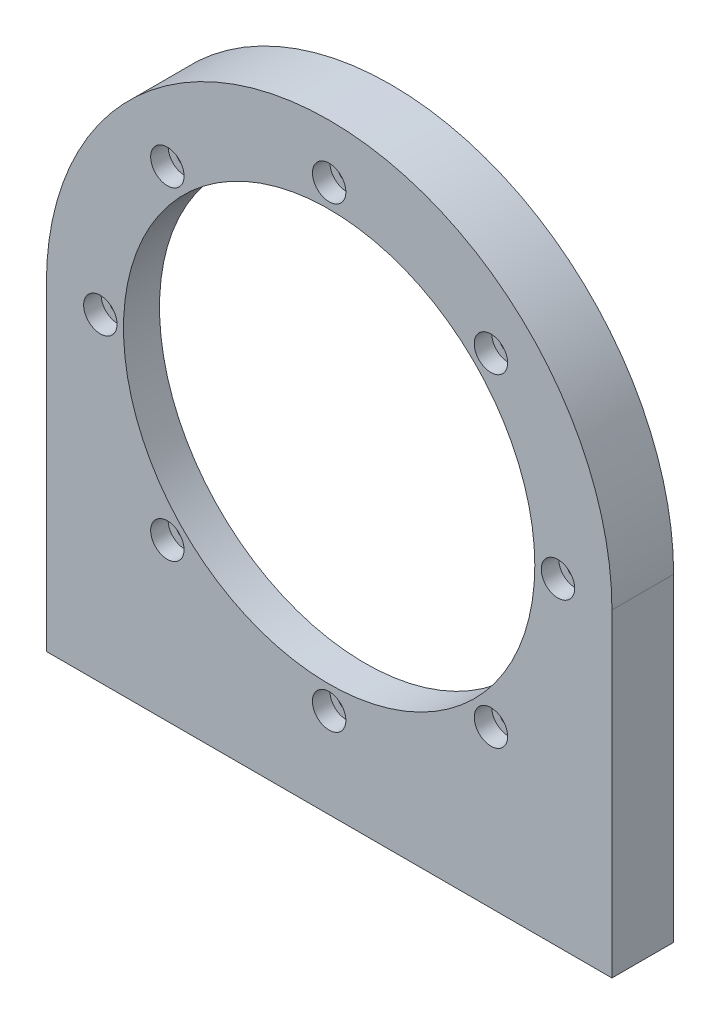
ISO-10303-21;
HEADER;
FILE_DESCRIPTION(('STEP AP214'),'2;1');
FILE_NAME('part.step','',(''),(''),'','','');
FILE_SCHEMA(('AUTOMOTIVE_DESIGN { 1 0 10303 214 1 1 1 1 }'));
ENDSEC;
DATA;
#1=APPLICATION_CONTEXT('core data for automotive mechanical design processes');
#2=APPLICATION_PROTOCOL_DEFINITION('international standard','automotive_design',2000,#1);
#3=PRODUCT_CONTEXT('',#1,'mechanical');
#4=PRODUCT('Part','Part','',(#3));
#5=PRODUCT_RELATED_PRODUCT_CATEGORY('part','',(#4));
#6=PRODUCT_DEFINITION_FORMATION('','',#4);
#7=PRODUCT_DEFINITION_CONTEXT('part definition',#1,'design');
#8=PRODUCT_DEFINITION('design','',#6,#7);
#9=PRODUCT_DEFINITION_SHAPE('','',#8);
#10=(LENGTH_UNIT() NAMED_UNIT(*) SI_UNIT(.MILLI.,.METRE.));
#11=(NAMED_UNIT(*) PLANE_ANGLE_UNIT() SI_UNIT($,.RADIAN.));
#12=(NAMED_UNIT(*) SI_UNIT($,.STERADIAN.) SOLID_ANGLE_UNIT());
#13=UNCERTAINTY_MEASURE_WITH_UNIT(LENGTH_MEASURE(1.E-05),#10,'distance_accuracy_value','');
#14=(GEOMETRIC_REPRESENTATION_CONTEXT(3) GLOBAL_UNCERTAINTY_ASSIGNED_CONTEXT((#13)) GLOBAL_UNIT_ASSIGNED_CONTEXT((#10,
#11,#12)) REPRESENTATION_CONTEXT('',''));
#15=CARTESIAN_POINT('',(0.,0.,0.));
#16=DIRECTION('',(0.,0.,1.));
#17=DIRECTION('',(1.,0.,0.));
#18=AXIS2_PLACEMENT_3D('',#15,#16,#17);
#19=CARTESIAN_POINT('',(0.,0.,7.));
#20=DIRECTION('',(0.,0.,-1.));
#21=DIRECTION('',(-1.,0.,0.));
#22=AXIS2_PLACEMENT_3D('',#19,#20,#21);
#23=CYLINDRICAL_SURFACE('',#22,55.);
#24=DIRECTION('',(0.,0.,1.));
#25=VECTOR('',#24,1.);
#26=CARTESIAN_POINT('',(-55.,0.,-131.269552941317));
#27=LINE('',#26,#25);
#28=CARTESIAN_POINT('',(-55.,0.,-5.));
#29=VERTEX_POINT('',#28);
#30=CARTESIAN_POINT('',(-55.,0.,7.));
#31=VERTEX_POINT('',#30);
#32=EDGE_CURVE('E60',#29,#31,#27,.T.);
#33=ORIENTED_EDGE('',*,*,#32,.T.);
#34=CARTESIAN_POINT('',(0.,0.,7.));
#35=DIRECTION('',(0.,0.,1.));
#36=DIRECTION('',(1.,0.,0.));
#37=AXIS2_PLACEMENT_3D('',#34,#35,#36);
#38=CIRCLE('',#37,55.);
#39=CARTESIAN_POINT('',(55.,0.,7.));
#40=VERTEX_POINT('',#39);
#41=EDGE_CURVE('E11',#40,#31,#38,.T.);
#42=ORIENTED_EDGE('',*,*,#41,.F.);
#43=DIRECTION('',(0.,0.,1.));
#44=VECTOR('',#43,1.);
#45=CARTESIAN_POINT('',(55.,0.,-131.269552941317));
#46=LINE('',#45,#44);
#47=CARTESIAN_POINT('',(55.,0.,-5.));
#48=VERTEX_POINT('',#47);
#49=EDGE_CURVE('E112',#48,#40,#46,.T.);
#50=ORIENTED_EDGE('',*,*,#49,.F.);
#51=CARTESIAN_POINT('',(0.,0.,-5.));
#52=DIRECTION('',(0.,0.,-1.));
#53=DIRECTION('',(-1.,0.,0.));
#54=AXIS2_PLACEMENT_3D('',#51,#52,#53);
#55=CIRCLE('',#54,55.);
#56=EDGE_CURVE('E140',#29,#48,#55,.T.);
#57=ORIENTED_EDGE('',*,*,#56,.F.);
#58=EDGE_LOOP('',(#33,#42,#50,#57));
#59=FACE_BOUND('',#58,.T.);
#60=ADVANCED_FACE('F45',(#59),#23,.T.);
#61=CARTESIAN_POINT('',(0.,0.,0.));
#62=DIRECTION('',(0.,0.,1.));
#63=DIRECTION('',(1.,0.,0.));
#64=AXIS2_PLACEMENT_3D('',#61,#62,#63);
#65=PLANE('',#64);
#66=CARTESIAN_POINT('',(0.,0.,0.));
#67=DIRECTION('',(0.,0.,1.));
#68=DIRECTION('',(1.,0.,0.));
#69=AXIS2_PLACEMENT_3D('',#66,#67,#68);
#70=CIRCLE('',#69,40.);
#71=CARTESIAN_POINT('',(40.,0.,0.));
#72=VERTEX_POINT('',#71);
#73=EDGE_CURVE('E274',#72,#72,#70,.T.);
#74=ORIENTED_EDGE('',*,*,#73,.T.);
#75=EDGE_LOOP('',(#74));
#76=FACE_BOUND('',#75,.T.);
#77=CARTESIAN_POINT('',(-31.4662517628008,31.4662517628,0.));
#78=DIRECTION('',(0.,0.,1.));
#79=DIRECTION('',(1.,0.,0.));
#80=AXIS2_PLACEMENT_3D('',#77,#78,#79);
#81=CIRCLE('',#80,1.7);
#82=CARTESIAN_POINT('',(-29.7662517628008,31.4662517628,0.));
#83=VERTEX_POINT('',#82);
#84=EDGE_CURVE('E270',#83,#83,#81,.T.);
#85=ORIENTED_EDGE('',*,*,#84,.T.);
#86=EDGE_LOOP('',(#85));
#87=FACE_BOUND('',#86,.T.);
#88=CARTESIAN_POINT('',(-44.4999999999981,-1.89442426535137E-12,0.));
#89=DIRECTION('',(0.,0.,1.));
#90=DIRECTION('',(1.,0.,0.));
#91=AXIS2_PLACEMENT_3D('',#88,#89,#90);
#92=CIRCLE('',#91,1.7);
#93=CARTESIAN_POINT('',(-42.7999999999981,-1.89442426535137E-12,0.));
#94=VERTEX_POINT('',#93);
#95=EDGE_CURVE('E254',#94,#94,#92,.T.);
#96=ORIENTED_EDGE('',*,*,#95,.T.);
#97=EDGE_LOOP('',(#96));
#98=FACE_BOUND('',#97,.T.);
#99=CARTESIAN_POINT('',(-31.4662517627981,-31.4662517628027,0.));
#100=DIRECTION('',(0.,0.,1.));
#101=DIRECTION('',(1.,0.,0.));
#102=AXIS2_PLACEMENT_3D('',#99,#100,#101);
#103=CIRCLE('',#102,1.7);
#104=CARTESIAN_POINT('',(-29.7662517627981,-31.4662517628027,0.));
#105=VERTEX_POINT('',#104);
#106=EDGE_CURVE('E238',#105,#105,#103,.T.);
#107=ORIENTED_EDGE('',*,*,#106,.T.);
#108=EDGE_LOOP('',(#107));
#109=FACE_BOUND('',#108,.T.);
#110=CARTESIAN_POINT('',(3.77794917419032E-12,-44.5,0.));
#111=DIRECTION('',(0.,0.,1.));
#112=DIRECTION('',(1.,0.,0.));
#113=AXIS2_PLACEMENT_3D('',#110,#111,#112);
#114=CIRCLE('',#113,1.7);
#115=CARTESIAN_POINT('',(1.70000000000378,-44.5,0.));
#116=VERTEX_POINT('',#115);
#117=EDGE_CURVE('E222',#116,#116,#114,.T.);
#118=ORIENTED_EDGE('',*,*,#117,.T.);
#119=EDGE_LOOP('',(#118));
#120=FACE_BOUND('',#119,.T.);
#121=CARTESIAN_POINT('',(31.4662517628046,-31.4662517628,0.));
#122=DIRECTION('',(0.,0.,1.));
#123=DIRECTION('',(1.,0.,0.));
#124=AXIS2_PLACEMENT_3D('',#121,#122,#123);
#125=CIRCLE('',#124,1.7);
#126=CARTESIAN_POINT('',(33.1662517628046,-31.4662517628,0.));
#127=VERTEX_POINT('',#126);
#128=EDGE_CURVE('E206',#127,#127,#125,.T.);
#129=ORIENTED_EDGE('',*,*,#128,.T.);
#130=EDGE_LOOP('',(#129));
#131=FACE_BOUND('',#130,.T.);
#132=CARTESIAN_POINT('',(44.5000000000019,1.88897458709516E-12,0.));
#133=DIRECTION('',(0.,0.,1.));
#134=DIRECTION('',(1.,0.,0.));
#135=AXIS2_PLACEMENT_3D('',#132,#133,#134);
#136=CIRCLE('',#135,1.7);
#137=CARTESIAN_POINT('',(46.2000000000019,1.88897458709516E-12,0.));
#138=VERTEX_POINT('',#137);
#139=EDGE_CURVE('E190',#138,#138,#136,.T.);
#140=ORIENTED_EDGE('',*,*,#139,.T.);
#141=EDGE_LOOP('',(#140));
#142=FACE_BOUND('',#141,.T.);
#143=CARTESIAN_POINT('',(31.4662517628019,31.4662517628027,0.));
#144=DIRECTION('',(0.,0.,1.));
#145=DIRECTION('',(1.,0.,0.));
#146=AXIS2_PLACEMENT_3D('',#143,#144,#145);
#147=CIRCLE('',#146,1.7);
#148=CARTESIAN_POINT('',(33.1662517628019,31.4662517628027,0.));
#149=VERTEX_POINT('',#148);
#150=EDGE_CURVE('E174',#149,#149,#147,.T.);
#151=ORIENTED_EDGE('',*,*,#150,.T.);
#152=EDGE_LOOP('',(#151));
#153=FACE_BOUND('',#152,.T.);
#154=CARTESIAN_POINT('',(0.,44.5,0.));
#155=DIRECTION('',(0.,0.,1.));
#156=DIRECTION('',(1.,0.,0.));
#157=AXIS2_PLACEMENT_3D('',#154,#155,#156);
#158=CIRCLE('',#157,1.7);
#159=CARTESIAN_POINT('',(1.7,44.5,0.));
#160=VERTEX_POINT('',#159);
#161=EDGE_CURVE('E158',#160,#160,#158,.T.);
#162=ORIENTED_EDGE('',*,*,#161,.T.);
#163=EDGE_LOOP('',(#162));
#164=FACE_BOUND('',#163,.T.);
#165=CARTESIAN_POINT('',(0.,0.,0.));
#166=DIRECTION('',(0.,0.,-1.));
#167=DIRECTION('',(-1.,0.,0.));
#168=AXIS2_PLACEMENT_3D('',#165,#166,#167);
#169=CIRCLE('',#168,50.);
#170=CARTESIAN_POINT('',(-50.,0.,0.));
#171=VERTEX_POINT('',#170);
#172=EDGE_CURVE('E135',#171,#171,#169,.T.);
#173=ORIENTED_EDGE('',*,*,#172,.T.);
#174=EDGE_LOOP('',(#173));
#175=FACE_BOUND('',#174,.T.);
#176=ADVANCED_FACE('F281',(#76,#87,#98,#109,#120,#131,#142,#153,#164,#175),#65,.F.);
#177=CARTESIAN_POINT('',(0.,0.,7.));
#178=DIRECTION('',(0.,0.,1.));
#179=DIRECTION('',(1.,0.,0.));
#180=AXIS2_PLACEMENT_3D('',#177,#178,#179);
#181=PLANE('',#180);
#182=CARTESIAN_POINT('',(0.,44.5,7.));
#183=DIRECTION('',(0.,0.,1.));
#184=DIRECTION('',(1.,0.,0.));
#185=AXIS2_PLACEMENT_3D('',#182,#183,#184);
#186=CIRCLE('',#185,3.25);
#187=CARTESIAN_POINT('',(3.25,44.5,7.));
#188=VERTEX_POINT('',#187);
#189=EDGE_CURVE('E146',#188,#188,#186,.T.);
#190=ORIENTED_EDGE('',*,*,#189,.F.);
#191=EDGE_LOOP('',(#190));
#192=FACE_BOUND('',#191,.T.);
#193=CARTESIAN_POINT('',(31.4662517628019,31.4662517628027,7.));
#194=DIRECTION('',(0.,0.,1.));
#195=DIRECTION('',(1.,0.,0.));
#196=AXIS2_PLACEMENT_3D('',#193,#194,#195);
#197=CIRCLE('',#196,3.25);
#198=CARTESIAN_POINT('',(34.7162517628019,31.4662517628027,7.));
#199=VERTEX_POINT('',#198);
#200=EDGE_CURVE('E162',#199,#199,#197,.T.);
#201=ORIENTED_EDGE('',*,*,#200,.F.);
#202=EDGE_LOOP('',(#201));
#203=FACE_BOUND('',#202,.T.);
#204=CARTESIAN_POINT('',(44.5000000000019,1.88897458709516E-12,7.));
#205=DIRECTION('',(0.,0.,1.));
#206=DIRECTION('',(1.,0.,0.));
#207=AXIS2_PLACEMENT_3D('',#204,#205,#206);
#208=CIRCLE('',#207,3.25);
#209=CARTESIAN_POINT('',(47.7500000000019,1.88897458709516E-12,7.));
#210=VERTEX_POINT('',#209);
#211=EDGE_CURVE('E178',#210,#210,#208,.T.);
#212=ORIENTED_EDGE('',*,*,#211,.F.);
#213=EDGE_LOOP('',(#212));
#214=FACE_BOUND('',#213,.T.);
#215=CARTESIAN_POINT('',(31.4662517628046,-31.4662517628,7.));
#216=DIRECTION('',(0.,0.,1.));
#217=DIRECTION('',(1.,0.,0.));
#218=AXIS2_PLACEMENT_3D('',#215,#216,#217);
#219=CIRCLE('',#218,3.25);
#220=CARTESIAN_POINT('',(34.7162517628046,-31.4662517628,7.));
#221=VERTEX_POINT('',#220);
#222=EDGE_CURVE('E194',#221,#221,#219,.T.);
#223=ORIENTED_EDGE('',*,*,#222,.F.);
#224=EDGE_LOOP('',(#223));
#225=FACE_BOUND('',#224,.T.);
#226=CARTESIAN_POINT('',(3.77794917419032E-12,-44.5,7.));
#227=DIRECTION('',(0.,0.,1.));
#228=DIRECTION('',(1.,0.,0.));
#229=AXIS2_PLACEMENT_3D('',#226,#227,#228);
#230=CIRCLE('',#229,3.25);
#231=CARTESIAN_POINT('',(3.25000000000378,-44.5,7.));
#232=VERTEX_POINT('',#231);
#233=EDGE_CURVE('E210',#232,#232,#230,.T.);
#234=ORIENTED_EDGE('',*,*,#233,.F.);
#235=EDGE_LOOP('',(#234));
#236=FACE_BOUND('',#235,.T.);
#237=CARTESIAN_POINT('',(-31.4662517627981,-31.4662517628027,7.));
#238=DIRECTION('',(0.,0.,1.));
#239=DIRECTION('',(1.,0.,0.));
#240=AXIS2_PLACEMENT_3D('',#237,#238,#239);
#241=CIRCLE('',#240,3.25);
#242=CARTESIAN_POINT('',(-28.2162517627981,-31.4662517628027,7.));
#243=VERTEX_POINT('',#242);
#244=EDGE_CURVE('E226',#243,#243,#241,.T.);
#245=ORIENTED_EDGE('',*,*,#244,.F.);
#246=EDGE_LOOP('',(#245));
#247=FACE_BOUND('',#246,.T.);
#248=CARTESIAN_POINT('',(-44.4999999999981,-1.89442426535137E-12,7.));
#249=DIRECTION('',(0.,0.,1.));
#250=DIRECTION('',(1.,0.,0.));
#251=AXIS2_PLACEMENT_3D('',#248,#249,#250);
#252=CIRCLE('',#251,3.25);
#253=CARTESIAN_POINT('',(-41.2499999999981,-1.89442426535137E-12,7.));
#254=VERTEX_POINT('',#253);
#255=EDGE_CURVE('E242',#254,#254,#252,.T.);
#256=ORIENTED_EDGE('',*,*,#255,.F.);
#257=EDGE_LOOP('',(#256));
#258=FACE_BOUND('',#257,.T.);
#259=CARTESIAN_POINT('',(-31.4662517628008,31.4662517628,7.));
#260=DIRECTION('',(0.,0.,1.));
#261=DIRECTION('',(1.,0.,0.));
#262=AXIS2_PLACEMENT_3D('',#259,#260,#261);
#263=CIRCLE('',#262,3.25);
#264=CARTESIAN_POINT('',(-28.2162517628008,31.4662517628,7.));
#265=VERTEX_POINT('',#264);
#266=EDGE_CURVE('E258',#265,#265,#263,.T.);
#267=ORIENTED_EDGE('',*,*,#266,.F.);
#268=EDGE_LOOP('',(#267));
#269=FACE_BOUND('',#268,.T.);
#270=ORIENTED_EDGE('',*,*,#41,.T.);
#271=DIRECTION('',(0.,-1.,0.));
#272=VECTOR('',#271,1.);
#273=CARTESIAN_POINT('',(-55.,0.,7.));
#274=LINE('',#273,#272);
#275=CARTESIAN_POINT('',(-55.,-62.,7.));
#276=VERTEX_POINT('',#275);
#277=EDGE_CURVE('E66',#31,#276,#274,.T.);
#278=ORIENTED_EDGE('',*,*,#277,.T.);
#279=DIRECTION('',(1.,0.,0.));
#280=VECTOR('',#279,1.);
#281=CARTESIAN_POINT('',(-55.,-62.,7.));
#282=LINE('',#281,#280);
#283=CARTESIAN_POINT('',(55.,-62.,7.));
#284=VERTEX_POINT('',#283);
#285=EDGE_CURVE('E97',#276,#284,#282,.T.);
#286=ORIENTED_EDGE('',*,*,#285,.T.);
#287=DIRECTION('',(0.,1.,0.));
#288=VECTOR('',#287,1.);
#289=CARTESIAN_POINT('',(55.,-62.,7.));
#290=LINE('',#289,#288);
#291=EDGE_CURVE('E106',#284,#40,#290,.T.);
#292=ORIENTED_EDGE('',*,*,#291,.T.);
#293=EDGE_LOOP('',(#270,#278,#286,#292));
#294=FACE_BOUND('',#293,.T.);
#295=CARTESIAN_POINT('',(0.,0.,7.));
#296=DIRECTION('',(0.,0.,1.));
#297=DIRECTION('',(1.,0.,0.));
#298=AXIS2_PLACEMENT_3D('',#295,#296,#297);
#299=CIRCLE('',#298,40.);
#300=CARTESIAN_POINT('',(40.,0.,7.));
#301=VERTEX_POINT('',#300);
#302=EDGE_CURVE('E53',#301,#301,#299,.T.);
#303=ORIENTED_EDGE('',*,*,#302,.F.);
#304=EDGE_LOOP('',(#303));
#305=FACE_BOUND('',#304,.T.);
#306=ADVANCED_FACE('F104',(#192,#203,#214,#225,#236,#247,#258,#269,#294,#305),#181,.T.);
#307=CARTESIAN_POINT('',(0.,0.,7.));
#308=DIRECTION('',(0.,0.,-1.));
#309=DIRECTION('',(-1.,0.,0.));
#310=AXIS2_PLACEMENT_3D('',#307,#308,#309);
#311=CYLINDRICAL_SURFACE('',#310,40.);
#312=ORIENTED_EDGE('',*,*,#302,.T.);
#313=EDGE_LOOP('',(#312));
#314=FACE_BOUND('',#313,.T.);
#315=ORIENTED_EDGE('',*,*,#73,.F.);
#316=EDGE_LOOP('',(#315));
#317=FACE_BOUND('',#316,.T.);
#318=ADVANCED_FACE('F284',(#314,#317),#311,.F.);
#319=CARTESIAN_POINT('',(-31.4662517628008,31.4662517628,7.));
#320=DIRECTION('',(0.,0.,1.));
#321=DIRECTION('',(1.,0.,0.));
#322=AXIS2_PLACEMENT_3D('',#319,#320,#321);
#323=CYLINDRICAL_SURFACE('',#322,1.7);
#324=ORIENTED_EDGE('',*,*,#84,.F.);
#325=EDGE_LOOP('',(#324));
#326=FACE_BOUND('',#325,.T.);
#327=CARTESIAN_POINT('',(-31.4662517628008,31.4662517628,3.6));
#328=DIRECTION('',(0.,0.,1.));
#329=DIRECTION('',(1.,0.,0.));
#330=AXIS2_PLACEMENT_3D('',#327,#328,#329);
#331=CIRCLE('',#330,1.7);
#332=CARTESIAN_POINT('',(-29.7662517628008,31.4662517628,3.6));
#333=VERTEX_POINT('',#332);
#334=EDGE_CURVE('E266',#333,#333,#331,.T.);
#335=ORIENTED_EDGE('',*,*,#334,.T.);
#336=EDGE_LOOP('',(#335));
#337=FACE_BOUND('',#336,.T.);
#338=ADVANCED_FACE('F286',(#326,#337),#323,.F.);
#339=CARTESIAN_POINT('',(-29.7662517628008,31.4662517628,3.6));
#340=DIRECTION('',(0.,0.,-1.));
#341=DIRECTION('',(-1.,0.,0.));
#342=AXIS2_PLACEMENT_3D('',#339,#340,#341);
#343=PLANE('',#342);
#344=ORIENTED_EDGE('',*,*,#334,.F.);
#345=EDGE_LOOP('',(#344));
#346=FACE_BOUND('',#345,.T.);
#347=CARTESIAN_POINT('',(-31.4662517628008,31.4662517628,3.6));
#348=DIRECTION('',(0.,0.,1.));
#349=DIRECTION('',(1.,0.,0.));
#350=AXIS2_PLACEMENT_3D('',#347,#348,#349);
#351=CIRCLE('',#350,3.25);
#352=CARTESIAN_POINT('',(-28.2162517628008,31.4662517628,3.6));
#353=VERTEX_POINT('',#352);
#354=EDGE_CURVE('E262',#353,#353,#351,.T.);
#355=ORIENTED_EDGE('',*,*,#354,.T.);
#356=EDGE_LOOP('',(#355));
#357=FACE_BOUND('',#356,.T.);
#358=ADVANCED_FACE('F292',(#346,#357),#343,.F.);
#359=CARTESIAN_POINT('',(-31.4662517628008,31.4662517628,7.));
#360=DIRECTION('',(0.,0.,1.));
#361=DIRECTION('',(1.,0.,0.));
#362=AXIS2_PLACEMENT_3D('',#359,#360,#361);
#363=CYLINDRICAL_SURFACE('',#362,3.25);
#364=ORIENTED_EDGE('',*,*,#354,.F.);
#365=EDGE_LOOP('',(#364));
#366=FACE_BOUND('',#365,.T.);
#367=ORIENTED_EDGE('',*,*,#266,.T.);
#368=EDGE_LOOP('',(#367));
#369=FACE_BOUND('',#368,.T.);
#370=ADVANCED_FACE('F406',(#366,#369),#363,.F.);
#371=CARTESIAN_POINT('',(-44.4999999999981,-1.89442426535137E-12,7.));
#372=DIRECTION('',(0.,0.,1.));
#373=DIRECTION('',(1.,0.,0.));
#374=AXIS2_PLACEMENT_3D('',#371,#372,#373);
#375=CYLINDRICAL_SURFACE('',#374,1.7);
#376=ORIENTED_EDGE('',*,*,#95,.F.);
#377=EDGE_LOOP('',(#376));
#378=FACE_BOUND('',#377,.T.);
#379=CARTESIAN_POINT('',(-44.4999999999981,-1.89442426535137E-12,3.6));
#380=DIRECTION('',(0.,0.,1.));
#381=DIRECTION('',(1.,0.,0.));
#382=AXIS2_PLACEMENT_3D('',#379,#380,#381);
#383=CIRCLE('',#382,1.7);
#384=CARTESIAN_POINT('',(-42.7999999999981,-1.89442426535137E-12,3.6));
#385=VERTEX_POINT('',#384);
#386=EDGE_CURVE('E250',#385,#385,#383,.T.);
#387=ORIENTED_EDGE('',*,*,#386,.T.);
#388=EDGE_LOOP('',(#387));
#389=FACE_BOUND('',#388,.T.);
#390=ADVANCED_FACE('F402',(#378,#389),#375,.F.);
#391=CARTESIAN_POINT('',(-42.7999999999981,-1.89442426535137E-12,3.6));
#392=DIRECTION('',(0.,0.,-1.));
#393=DIRECTION('',(-1.,0.,0.));
#394=AXIS2_PLACEMENT_3D('',#391,#392,#393);
#395=PLANE('',#394);
#396=ORIENTED_EDGE('',*,*,#386,.F.);
#397=EDGE_LOOP('',(#396));
#398=FACE_BOUND('',#397,.T.);
#399=CARTESIAN_POINT('',(-44.4999999999981,-1.89442426535137E-12,3.6));
#400=DIRECTION('',(0.,0.,1.));
#401=DIRECTION('',(1.,0.,0.));
#402=AXIS2_PLACEMENT_3D('',#399,#400,#401);
#403=CIRCLE('',#402,3.25);
#404=CARTESIAN_POINT('',(-41.2499999999981,-1.89442426535137E-12,3.6));
#405=VERTEX_POINT('',#404);
#406=EDGE_CURVE('E246',#405,#405,#403,.T.);
#407=ORIENTED_EDGE('',*,*,#406,.T.);
#408=EDGE_LOOP('',(#407));
#409=FACE_BOUND('',#408,.T.);
#410=ADVANCED_FACE('F398',(#398,#409),#395,.F.);
#411=CARTESIAN_POINT('',(-44.4999999999981,-1.89442426535137E-12,7.));
#412=DIRECTION('',(0.,0.,1.));
#413=DIRECTION('',(1.,0.,0.));
#414=AXIS2_PLACEMENT_3D('',#411,#412,#413);
#415=CYLINDRICAL_SURFACE('',#414,3.25);
#416=ORIENTED_EDGE('',*,*,#406,.F.);
#417=EDGE_LOOP('',(#416));
#418=FACE_BOUND('',#417,.T.);
#419=ORIENTED_EDGE('',*,*,#255,.T.);
#420=EDGE_LOOP('',(#419));
#421=FACE_BOUND('',#420,.T.);
#422=ADVANCED_FACE('F394',(#418,#421),#415,.F.);
#423=CARTESIAN_POINT('',(-31.4662517627981,-31.4662517628027,7.));
#424=DIRECTION('',(0.,0.,1.));
#425=DIRECTION('',(1.,0.,0.));
#426=AXIS2_PLACEMENT_3D('',#423,#424,#425);
#427=CYLINDRICAL_SURFACE('',#426,1.7);
#428=ORIENTED_EDGE('',*,*,#106,.F.);
#429=EDGE_LOOP('',(#428));
#430=FACE_BOUND('',#429,.T.);
#431=CARTESIAN_POINT('',(-31.4662517627981,-31.4662517628027,3.6));
#432=DIRECTION('',(0.,0.,1.));
#433=DIRECTION('',(1.,0.,0.));
#434=AXIS2_PLACEMENT_3D('',#431,#432,#433);
#435=CIRCLE('',#434,1.7);
#436=CARTESIAN_POINT('',(-29.7662517627981,-31.4662517628027,3.6));
#437=VERTEX_POINT('',#436);
#438=EDGE_CURVE('E234',#437,#437,#435,.T.);
#439=ORIENTED_EDGE('',*,*,#438,.T.);
#440=EDGE_LOOP('',(#439));
#441=FACE_BOUND('',#440,.T.);
#442=ADVANCED_FACE('F390',(#430,#441),#427,.F.);
#443=CARTESIAN_POINT('',(-29.7662517627981,-31.4662517628027,3.6));
#444=DIRECTION('',(0.,0.,-1.));
#445=DIRECTION('',(-1.,0.,0.));
#446=AXIS2_PLACEMENT_3D('',#443,#444,#445);
#447=PLANE('',#446);
#448=ORIENTED_EDGE('',*,*,#438,.F.);
#449=EDGE_LOOP('',(#448));
#450=FACE_BOUND('',#449,.T.);
#451=CARTESIAN_POINT('',(-31.4662517627981,-31.4662517628027,3.6));
#452=DIRECTION('',(0.,0.,1.));
#453=DIRECTION('',(1.,0.,0.));
#454=AXIS2_PLACEMENT_3D('',#451,#452,#453);
#455=CIRCLE('',#454,3.25);
#456=CARTESIAN_POINT('',(-28.2162517627981,-31.4662517628027,3.6));
#457=VERTEX_POINT('',#456);
#458=EDGE_CURVE('E230',#457,#457,#455,.T.);
#459=ORIENTED_EDGE('',*,*,#458,.T.);
#460=EDGE_LOOP('',(#459));
#461=FACE_BOUND('',#460,.T.);
#462=ADVANCED_FACE('F386',(#450,#461),#447,.F.);
#463=CARTESIAN_POINT('',(-31.4662517627981,-31.4662517628027,7.));
#464=DIRECTION('',(0.,0.,1.));
#465=DIRECTION('',(1.,0.,0.));
#466=AXIS2_PLACEMENT_3D('',#463,#464,#465);
#467=CYLINDRICAL_SURFACE('',#466,3.25);
#468=ORIENTED_EDGE('',*,*,#458,.F.);
#469=EDGE_LOOP('',(#468));
#470=FACE_BOUND('',#469,.T.);
#471=ORIENTED_EDGE('',*,*,#244,.T.);
#472=EDGE_LOOP('',(#471));
#473=FACE_BOUND('',#472,.T.);
#474=ADVANCED_FACE('F382',(#470,#473),#467,.F.);
#475=CARTESIAN_POINT('',(3.77794917419032E-12,-44.5,7.));
#476=DIRECTION('',(0.,0.,1.));
#477=DIRECTION('',(1.,0.,0.));
#478=AXIS2_PLACEMENT_3D('',#475,#476,#477);
#479=CYLINDRICAL_SURFACE('',#478,1.7);
#480=ORIENTED_EDGE('',*,*,#117,.F.);
#481=EDGE_LOOP('',(#480));
#482=FACE_BOUND('',#481,.T.);
#483=CARTESIAN_POINT('',(3.77794917419032E-12,-44.5,3.6));
#484=DIRECTION('',(0.,0.,1.));
#485=DIRECTION('',(1.,0.,0.));
#486=AXIS2_PLACEMENT_3D('',#483,#484,#485);
#487=CIRCLE('',#486,1.7);
#488=CARTESIAN_POINT('',(1.70000000000378,-44.5,3.6));
#489=VERTEX_POINT('',#488);
#490=EDGE_CURVE('E218',#489,#489,#487,.T.);
#491=ORIENTED_EDGE('',*,*,#490,.T.);
#492=EDGE_LOOP('',(#491));
#493=FACE_BOUND('',#492,.T.);
#494=ADVANCED_FACE('F378',(#482,#493),#479,.F.);
#495=CARTESIAN_POINT('',(1.70000000000378,-44.5,3.6));
#496=DIRECTION('',(0.,0.,-1.));
#497=DIRECTION('',(-1.,0.,0.));
#498=AXIS2_PLACEMENT_3D('',#495,#496,#497);
#499=PLANE('',#498);
#500=ORIENTED_EDGE('',*,*,#490,.F.);
#501=EDGE_LOOP('',(#500));
#502=FACE_BOUND('',#501,.T.);
#503=CARTESIAN_POINT('',(3.77794917419032E-12,-44.5,3.6));
#504=DIRECTION('',(0.,0.,1.));
#505=DIRECTION('',(1.,0.,0.));
#506=AXIS2_PLACEMENT_3D('',#503,#504,#505);
#507=CIRCLE('',#506,3.25);
#508=CARTESIAN_POINT('',(3.25000000000378,-44.5,3.6));
#509=VERTEX_POINT('',#508);
#510=EDGE_CURVE('E214',#509,#509,#507,.T.);
#511=ORIENTED_EDGE('',*,*,#510,.T.);
#512=EDGE_LOOP('',(#511));
#513=FACE_BOUND('',#512,.T.);
#514=ADVANCED_FACE('F374',(#502,#513),#499,.F.);
#515=CARTESIAN_POINT('',(3.77794917419032E-12,-44.5,7.));
#516=DIRECTION('',(0.,0.,1.));
#517=DIRECTION('',(1.,0.,0.));
#518=AXIS2_PLACEMENT_3D('',#515,#516,#517);
#519=CYLINDRICAL_SURFACE('',#518,3.25);
#520=ORIENTED_EDGE('',*,*,#510,.F.);
#521=EDGE_LOOP('',(#520));
#522=FACE_BOUND('',#521,.T.);
#523=ORIENTED_EDGE('',*,*,#233,.T.);
#524=EDGE_LOOP('',(#523));
#525=FACE_BOUND('',#524,.T.);
#526=ADVANCED_FACE('F370',(#522,#525),#519,.F.);
#527=CARTESIAN_POINT('',(31.4662517628046,-31.4662517628,7.));
#528=DIRECTION('',(0.,0.,1.));
#529=DIRECTION('',(1.,0.,0.));
#530=AXIS2_PLACEMENT_3D('',#527,#528,#529);
#531=CYLINDRICAL_SURFACE('',#530,1.7);
#532=ORIENTED_EDGE('',*,*,#128,.F.);
#533=EDGE_LOOP('',(#532));
#534=FACE_BOUND('',#533,.T.);
#535=CARTESIAN_POINT('',(31.4662517628046,-31.4662517628,3.6));
#536=DIRECTION('',(0.,0.,1.));
#537=DIRECTION('',(1.,0.,0.));
#538=AXIS2_PLACEMENT_3D('',#535,#536,#537);
#539=CIRCLE('',#538,1.7);
#540=CARTESIAN_POINT('',(33.1662517628046,-31.4662517628,3.6));
#541=VERTEX_POINT('',#540);
#542=EDGE_CURVE('E202',#541,#541,#539,.T.);
#543=ORIENTED_EDGE('',*,*,#542,.T.);
#544=EDGE_LOOP('',(#543));
#545=FACE_BOUND('',#544,.T.);
#546=ADVANCED_FACE('F366',(#534,#545),#531,.F.);
#547=CARTESIAN_POINT('',(33.1662517628046,-31.4662517628,3.6));
#548=DIRECTION('',(0.,0.,-1.));
#549=DIRECTION('',(-1.,0.,0.));
#550=AXIS2_PLACEMENT_3D('',#547,#548,#549);
#551=PLANE('',#550);
#552=ORIENTED_EDGE('',*,*,#542,.F.);
#553=EDGE_LOOP('',(#552));
#554=FACE_BOUND('',#553,.T.);
#555=CARTESIAN_POINT('',(31.4662517628046,-31.4662517628,3.6));
#556=DIRECTION('',(0.,0.,1.));
#557=DIRECTION('',(1.,0.,0.));
#558=AXIS2_PLACEMENT_3D('',#555,#556,#557);
#559=CIRCLE('',#558,3.25);
#560=CARTESIAN_POINT('',(34.7162517628046,-31.4662517628,3.6));
#561=VERTEX_POINT('',#560);
#562=EDGE_CURVE('E198',#561,#561,#559,.T.);
#563=ORIENTED_EDGE('',*,*,#562,.T.);
#564=EDGE_LOOP('',(#563));
#565=FACE_BOUND('',#564,.T.);
#566=ADVANCED_FACE('F362',(#554,#565),#551,.F.);
#567=CARTESIAN_POINT('',(31.4662517628046,-31.4662517628,7.));
#568=DIRECTION('',(0.,0.,1.));
#569=DIRECTION('',(1.,0.,0.));
#570=AXIS2_PLACEMENT_3D('',#567,#568,#569);
#571=CYLINDRICAL_SURFACE('',#570,3.25);
#572=ORIENTED_EDGE('',*,*,#562,.F.);
#573=EDGE_LOOP('',(#572));
#574=FACE_BOUND('',#573,.T.);
#575=ORIENTED_EDGE('',*,*,#222,.T.);
#576=EDGE_LOOP('',(#575));
#577=FACE_BOUND('',#576,.T.);
#578=ADVANCED_FACE('F358',(#574,#577),#571,.F.);
#579=CARTESIAN_POINT('',(44.5000000000019,1.88897458709516E-12,7.));
#580=DIRECTION('',(0.,0.,1.));
#581=DIRECTION('',(1.,0.,0.));
#582=AXIS2_PLACEMENT_3D('',#579,#580,#581);
#583=CYLINDRICAL_SURFACE('',#582,1.7);
#584=ORIENTED_EDGE('',*,*,#139,.F.);
#585=EDGE_LOOP('',(#584));
#586=FACE_BOUND('',#585,.T.);
#587=CARTESIAN_POINT('',(44.5000000000019,1.88897458709516E-12,3.6));
#588=DIRECTION('',(0.,0.,1.));
#589=DIRECTION('',(1.,0.,0.));
#590=AXIS2_PLACEMENT_3D('',#587,#588,#589);
#591=CIRCLE('',#590,1.7);
#592=CARTESIAN_POINT('',(46.2000000000019,1.88897458709516E-12,3.6));
#593=VERTEX_POINT('',#592);
#594=EDGE_CURVE('E186',#593,#593,#591,.T.);
#595=ORIENTED_EDGE('',*,*,#594,.T.);
#596=EDGE_LOOP('',(#595));
#597=FACE_BOUND('',#596,.T.);
#598=ADVANCED_FACE('F354',(#586,#597),#583,.F.);
#599=CARTESIAN_POINT('',(46.2000000000019,1.88897458709516E-12,3.6));
#600=DIRECTION('',(0.,0.,-1.));
#601=DIRECTION('',(-1.,0.,0.));
#602=AXIS2_PLACEMENT_3D('',#599,#600,#601);
#603=PLANE('',#602);
#604=ORIENTED_EDGE('',*,*,#594,.F.);
#605=EDGE_LOOP('',(#604));
#606=FACE_BOUND('',#605,.T.);
#607=CARTESIAN_POINT('',(44.5000000000019,1.88897458709516E-12,3.6));
#608=DIRECTION('',(0.,0.,1.));
#609=DIRECTION('',(1.,0.,0.));
#610=AXIS2_PLACEMENT_3D('',#607,#608,#609);
#611=CIRCLE('',#610,3.25);
#612=CARTESIAN_POINT('',(47.7500000000019,1.88897458709516E-12,3.6));
#613=VERTEX_POINT('',#612);
#614=EDGE_CURVE('E182',#613,#613,#611,.T.);
#615=ORIENTED_EDGE('',*,*,#614,.T.);
#616=EDGE_LOOP('',(#615));
#617=FACE_BOUND('',#616,.T.);
#618=ADVANCED_FACE('F350',(#606,#617),#603,.F.);
#619=CARTESIAN_POINT('',(44.5000000000019,1.88897458709516E-12,7.));
#620=DIRECTION('',(0.,0.,1.));
#621=DIRECTION('',(1.,0.,0.));
#622=AXIS2_PLACEMENT_3D('',#619,#620,#621);
#623=CYLINDRICAL_SURFACE('',#622,3.25);
#624=ORIENTED_EDGE('',*,*,#614,.F.);
#625=EDGE_LOOP('',(#624));
#626=FACE_BOUND('',#625,.T.);
#627=ORIENTED_EDGE('',*,*,#211,.T.);
#628=EDGE_LOOP('',(#627));
#629=FACE_BOUND('',#628,.T.);
#630=ADVANCED_FACE('F346',(#626,#629),#623,.F.);
#631=CARTESIAN_POINT('',(31.4662517628019,31.4662517628027,7.));
#632=DIRECTION('',(0.,0.,1.));
#633=DIRECTION('',(1.,0.,0.));
#634=AXIS2_PLACEMENT_3D('',#631,#632,#633);
#635=CYLINDRICAL_SURFACE('',#634,1.7);
#636=ORIENTED_EDGE('',*,*,#150,.F.);
#637=EDGE_LOOP('',(#636));
#638=FACE_BOUND('',#637,.T.);
#639=CARTESIAN_POINT('',(31.4662517628019,31.4662517628027,3.6));
#640=DIRECTION('',(0.,0.,1.));
#641=DIRECTION('',(1.,0.,0.));
#642=AXIS2_PLACEMENT_3D('',#639,#640,#641);
#643=CIRCLE('',#642,1.7);
#644=CARTESIAN_POINT('',(33.1662517628019,31.4662517628027,3.6));
#645=VERTEX_POINT('',#644);
#646=EDGE_CURVE('E170',#645,#645,#643,.T.);
#647=ORIENTED_EDGE('',*,*,#646,.T.);
#648=EDGE_LOOP('',(#647));
#649=FACE_BOUND('',#648,.T.);
#650=ADVANCED_FACE('F342',(#638,#649),#635,.F.);
#651=CARTESIAN_POINT('',(33.1662517628019,31.4662517628027,3.6));
#652=DIRECTION('',(0.,0.,-1.));
#653=DIRECTION('',(-1.,0.,0.));
#654=AXIS2_PLACEMENT_3D('',#651,#652,#653);
#655=PLANE('',#654);
#656=ORIENTED_EDGE('',*,*,#646,.F.);
#657=EDGE_LOOP('',(#656));
#658=FACE_BOUND('',#657,.T.);
#659=CARTESIAN_POINT('',(31.4662517628019,31.4662517628027,3.6));
#660=DIRECTION('',(0.,0.,1.));
#661=DIRECTION('',(1.,0.,0.));
#662=AXIS2_PLACEMENT_3D('',#659,#660,#661);
#663=CIRCLE('',#662,3.25);
#664=CARTESIAN_POINT('',(34.7162517628019,31.4662517628027,3.6));
#665=VERTEX_POINT('',#664);
#666=EDGE_CURVE('E166',#665,#665,#663,.T.);
#667=ORIENTED_EDGE('',*,*,#666,.T.);
#668=EDGE_LOOP('',(#667));
#669=FACE_BOUND('',#668,.T.);
#670=ADVANCED_FACE('F338',(#658,#669),#655,.F.);
#671=CARTESIAN_POINT('',(31.4662517628019,31.4662517628027,7.));
#672=DIRECTION('',(0.,0.,1.));
#673=DIRECTION('',(1.,0.,0.));
#674=AXIS2_PLACEMENT_3D('',#671,#672,#673);
#675=CYLINDRICAL_SURFACE('',#674,3.25);
#676=ORIENTED_EDGE('',*,*,#666,.F.);
#677=EDGE_LOOP('',(#676));
#678=FACE_BOUND('',#677,.T.);
#679=ORIENTED_EDGE('',*,*,#200,.T.);
#680=EDGE_LOOP('',(#679));
#681=FACE_BOUND('',#680,.T.);
#682=ADVANCED_FACE('F334',(#678,#681),#675,.F.);
#683=CARTESIAN_POINT('',(0.,44.5,7.));
#684=DIRECTION('',(0.,0.,1.));
#685=DIRECTION('',(1.,0.,0.));
#686=AXIS2_PLACEMENT_3D('',#683,#684,#685);
#687=CYLINDRICAL_SURFACE('',#686,1.7);
#688=ORIENTED_EDGE('',*,*,#161,.F.);
#689=EDGE_LOOP('',(#688));
#690=FACE_BOUND('',#689,.T.);
#691=CARTESIAN_POINT('',(0.,44.5,3.6));
#692=DIRECTION('',(0.,0.,1.));
#693=DIRECTION('',(1.,0.,0.));
#694=AXIS2_PLACEMENT_3D('',#691,#692,#693);
#695=CIRCLE('',#694,1.7);
#696=CARTESIAN_POINT('',(1.7,44.5,3.6));
#697=VERTEX_POINT('',#696);
#698=EDGE_CURVE('E154',#697,#697,#695,.T.);
#699=ORIENTED_EDGE('',*,*,#698,.T.);
#700=EDGE_LOOP('',(#699));
#701=FACE_BOUND('',#700,.T.);
#702=ADVANCED_FACE('F330',(#690,#701),#687,.F.);
#703=CARTESIAN_POINT('',(1.7,44.5,3.6));
#704=DIRECTION('',(0.,0.,-1.));
#705=DIRECTION('',(-1.,0.,0.));
#706=AXIS2_PLACEMENT_3D('',#703,#704,#705);
#707=PLANE('',#706);
#708=ORIENTED_EDGE('',*,*,#698,.F.);
#709=EDGE_LOOP('',(#708));
#710=FACE_BOUND('',#709,.T.);
#711=CARTESIAN_POINT('',(0.,44.5,3.6));
#712=DIRECTION('',(0.,0.,1.));
#713=DIRECTION('',(1.,0.,0.));
#714=AXIS2_PLACEMENT_3D('',#711,#712,#713);
#715=CIRCLE('',#714,3.25);
#716=CARTESIAN_POINT('',(3.25,44.5,3.6));
#717=VERTEX_POINT('',#716);
#718=EDGE_CURVE('E150',#717,#717,#715,.T.);
#719=ORIENTED_EDGE('',*,*,#718,.T.);
#720=EDGE_LOOP('',(#719));
#721=FACE_BOUND('',#720,.T.);
#722=ADVANCED_FACE('F326',(#710,#721),#707,.F.);
#723=CARTESIAN_POINT('',(0.,44.5,7.));
#724=DIRECTION('',(0.,0.,1.));
#725=DIRECTION('',(1.,0.,0.));
#726=AXIS2_PLACEMENT_3D('',#723,#724,#725);
#727=CYLINDRICAL_SURFACE('',#726,3.25);
#728=ORIENTED_EDGE('',*,*,#718,.F.);
#729=EDGE_LOOP('',(#728));
#730=FACE_BOUND('',#729,.T.);
#731=ORIENTED_EDGE('',*,*,#189,.T.);
#732=EDGE_LOOP('',(#731));
#733=FACE_BOUND('',#732,.T.);
#734=ADVANCED_FACE('F323',(#730,#733),#727,.F.);
#735=CARTESIAN_POINT('',(0.,0.,-5.));
#736=DIRECTION('',(0.,0.,-1.));
#737=DIRECTION('',(-1.,0.,0.));
#738=AXIS2_PLACEMENT_3D('',#735,#736,#737);
#739=PLANE('',#738);
#740=ORIENTED_EDGE('',*,*,#56,.T.);
#741=DIRECTION('',(0.,1.,0.));
#742=VECTOR('',#741,1.);
#743=CARTESIAN_POINT('',(55.,-62.,-5.));
#744=LINE('',#743,#742);
#745=CARTESIAN_POINT('',(55.,-62.,-5.));
#746=VERTEX_POINT('',#745);
#747=EDGE_CURVE('E83',#746,#48,#744,.T.);
#748=ORIENTED_EDGE('',*,*,#747,.F.);
#749=DIRECTION('',(1.,0.,0.));
#750=VECTOR('',#749,1.);
#751=CARTESIAN_POINT('',(-55.,-62.,-5.));
#752=LINE('',#751,#750);
#753=CARTESIAN_POINT('',(-55.,-62.,-5.));
#754=VERTEX_POINT('',#753);
#755=EDGE_CURVE('E87',#754,#746,#752,.T.);
#756=ORIENTED_EDGE('',*,*,#755,.F.);
#757=DIRECTION('',(0.,-1.,0.));
#758=VECTOR('',#757,1.);
#759=CARTESIAN_POINT('',(-55.,0.,-5.));
#760=LINE('',#759,#758);
#761=EDGE_CURVE('E114',#29,#754,#760,.T.);
#762=ORIENTED_EDGE('',*,*,#761,.F.);
#763=EDGE_LOOP('',(#740,#748,#756,#762));
#764=FACE_BOUND('',#763,.T.);
#765=CARTESIAN_POINT('',(0.,0.,-5.));
#766=DIRECTION('',(0.,0.,-1.));
#767=DIRECTION('',(-1.,0.,0.));
#768=AXIS2_PLACEMENT_3D('',#765,#766,#767);
#769=CIRCLE('',#768,50.);
#770=CARTESIAN_POINT('',(-50.,0.,-5.));
#771=VERTEX_POINT('',#770);
#772=EDGE_CURVE('E136',#771,#771,#769,.T.);
#773=ORIENTED_EDGE('',*,*,#772,.F.);
#774=EDGE_LOOP('',(#773));
#775=FACE_BOUND('',#774,.T.);
#776=ADVANCED_FACE('F305',(#764,#775),#739,.T.);
#777=CARTESIAN_POINT('',(0.,0.,-5.));
#778=DIRECTION('',(0.,0.,1.));
#779=DIRECTION('',(1.,0.,0.));
#780=AXIS2_PLACEMENT_3D('',#777,#778,#779);
#781=CYLINDRICAL_SURFACE('',#780,50.);
#782=ORIENTED_EDGE('',*,*,#772,.T.);
#783=EDGE_LOOP('',(#782));
#784=FACE_BOUND('',#783,.T.);
#785=ORIENTED_EDGE('',*,*,#172,.F.);
#786=EDGE_LOOP('',(#785));
#787=FACE_BOUND('',#786,.T.);
#788=ADVANCED_FACE('F309',(#784,#787),#781,.F.);
#789=CARTESIAN_POINT('',(-55.,0.,-131.269552941317));
#790=DIRECTION('',(-1.,0.,0.));
#791=DIRECTION('',(0.,-1.,0.));
#792=AXIS2_PLACEMENT_3D('',#789,#790,#791);
#793=PLANE('',#792);
#794=ORIENTED_EDGE('',*,*,#32,.F.);
#795=ORIENTED_EDGE('',*,*,#761,.T.);
#796=DIRECTION('',(0.,0.,1.));
#797=VECTOR('',#796,1.);
#798=CARTESIAN_POINT('',(-55.,-62.,-131.269552941317));
#799=LINE('',#798,#797);
#800=EDGE_CURVE('E117',#754,#276,#799,.T.);
#801=ORIENTED_EDGE('',*,*,#800,.T.);
#802=ORIENTED_EDGE('',*,*,#277,.F.);
#803=EDGE_LOOP('',(#794,#795,#801,#802));
#804=FACE_BOUND('',#803,.T.);
#805=ADVANCED_FACE('F307',(#804),#793,.T.);
#806=CARTESIAN_POINT('',(-55.,-62.,-131.269552941317));
#807=DIRECTION('',(0.,-1.,0.));
#808=DIRECTION('',(0.,0.,-1.));
#809=AXIS2_PLACEMENT_3D('',#806,#807,#808);
#810=PLANE('',#809);
#811=CARTESIAN_POINT('',(-50.,-62.,0.999999999999997));
#812=DIRECTION('',(0.,-1.,0.));
#813=DIRECTION('',(0.,0.,-1.));
#814=AXIS2_PLACEMENT_3D('',#811,#812,#813);
#815=CIRCLE('',#814,1.575);
#816=CARTESIAN_POINT('',(-50.,-62.,-0.575000000000003));
#817=VERTEX_POINT('',#816);
#818=EDGE_CURVE('E692',#817,#817,#815,.T.);
#819=ORIENTED_EDGE('',*,*,#818,.F.);
#820=EDGE_LOOP('',(#819));
#821=FACE_BOUND('',#820,.T.);
#822=CARTESIAN_POINT('',(-25.,-62.,0.999999999999997));
#823=DIRECTION('',(0.,-1.,0.));
#824=DIRECTION('',(0.,0.,-1.));
#825=AXIS2_PLACEMENT_3D('',#822,#823,#824);
#826=CIRCLE('',#825,1.575);
#827=CARTESIAN_POINT('',(-25.,-62.,-0.575000000000003));
#828=VERTEX_POINT('',#827);
#829=EDGE_CURVE('E696',#828,#828,#826,.T.);
#830=ORIENTED_EDGE('',*,*,#829,.F.);
#831=EDGE_LOOP('',(#830));
#832=FACE_BOUND('',#831,.T.);
#833=CARTESIAN_POINT('',(0.,-62.,0.999999999999997));
#834=DIRECTION('',(0.,-1.,0.));
#835=DIRECTION('',(0.,0.,-1.));
#836=AXIS2_PLACEMENT_3D('',#833,#834,#835);
#837=CIRCLE('',#836,1.575);
#838=CARTESIAN_POINT('',(0.,-62.,-0.575000000000002));
#839=VERTEX_POINT('',#838);
#840=EDGE_CURVE('E706',#839,#839,#837,.T.);
#841=ORIENTED_EDGE('',*,*,#840,.F.);
#842=EDGE_LOOP('',(#841));
#843=FACE_BOUND('',#842,.T.);
#844=CARTESIAN_POINT('',(25.,-62.,0.999999999999997));
#845=DIRECTION('',(0.,-1.,0.));
#846=DIRECTION('',(0.,0.,-1.));
#847=AXIS2_PLACEMENT_3D('',#844,#845,#846);
#848=CIRCLE('',#847,1.575);
#849=CARTESIAN_POINT('',(25.,-62.,-0.575000000000003));
#850=VERTEX_POINT('',#849);
#851=EDGE_CURVE('E714',#850,#850,#848,.T.);
#852=ORIENTED_EDGE('',*,*,#851,.F.);
#853=EDGE_LOOP('',(#852));
#854=FACE_BOUND('',#853,.T.);
#855=CARTESIAN_POINT('',(50.,-62.,0.999999999999997));
#856=DIRECTION('',(0.,-1.,0.));
#857=DIRECTION('',(0.,0.,-1.));
#858=AXIS2_PLACEMENT_3D('',#855,#856,#857);
#859=CIRCLE('',#858,1.575);
#860=CARTESIAN_POINT('',(50.,-62.,-0.575000000000003));
#861=VERTEX_POINT('',#860);
#862=EDGE_CURVE('E721',#861,#861,#859,.T.);
#863=ORIENTED_EDGE('',*,*,#862,.F.);
#864=EDGE_LOOP('',(#863));
#865=FACE_BOUND('',#864,.T.);
#866=ORIENTED_EDGE('',*,*,#800,.F.);
#867=ORIENTED_EDGE('',*,*,#755,.T.);
#868=DIRECTION('',(0.,0.,1.));
#869=VECTOR('',#868,1.);
#870=CARTESIAN_POINT('',(55.,-62.,-131.269552941317));
#871=LINE('',#870,#869);
#872=EDGE_CURVE('E94',#746,#284,#871,.T.);
#873=ORIENTED_EDGE('',*,*,#872,.T.);
#874=ORIENTED_EDGE('',*,*,#285,.F.);
#875=EDGE_LOOP('',(#866,#867,#873,#874));
#876=FACE_BOUND('',#875,.T.);
#877=ADVANCED_FACE('F96',(#821,#832,#843,#854,#865,#876),#810,.T.);
#878=CARTESIAN_POINT('',(55.,-62.,-131.269552941317));
#879=DIRECTION('',(1.,0.,0.));
#880=DIRECTION('',(0.,0.,-1.));
#881=AXIS2_PLACEMENT_3D('',#878,#879,#880);
#882=PLANE('',#881);
#883=ORIENTED_EDGE('',*,*,#872,.F.);
#884=ORIENTED_EDGE('',*,*,#747,.T.);
#885=ORIENTED_EDGE('',*,*,#49,.T.);
#886=ORIENTED_EDGE('',*,*,#291,.F.);
#887=EDGE_LOOP('',(#883,#884,#885,#886));
#888=FACE_BOUND('',#887,.T.);
#889=ADVANCED_FACE('F110',(#888),#882,.T.);
#890=CARTESIAN_POINT('',(50.,-52.,0.999999999999997));
#891=DIRECTION('',(0.,-1.,0.));
#892=DIRECTION('',(0.,0.,-1.));
#893=AXIS2_PLACEMENT_3D('',#890,#891,#892);
#894=CONICAL_SURFACE('',#893,1.575,1.02974425867665);
#895=CARTESIAN_POINT('',(50.,-51.0536445250316,0.999999999999997));
#896=VERTEX_POINT('',#895);
#897=VERTEX_LOOP('',#896);
#898=FACE_BOUND('',#897,.T.);
#899=CARTESIAN_POINT('',(50.,-52.,0.999999999999997));
#900=DIRECTION('',(0.,-1.,0.));
#901=DIRECTION('',(0.,0.,-1.));
#902=AXIS2_PLACEMENT_3D('',#899,#900,#901);
#903=CIRCLE('',#902,1.575);
#904=CARTESIAN_POINT('',(50.,-52.,-0.575000000000003));
#905=VERTEX_POINT('',#904);
#906=EDGE_CURVE('E120',#905,#905,#903,.T.);
#907=ORIENTED_EDGE('',*,*,#906,.T.);
#908=EDGE_LOOP('',(#907));
#909=FACE_BOUND('',#908,.T.);
#910=ADVANCED_FACE('F586',(#898,#909),#894,.F.);
#911=CARTESIAN_POINT('',(50.,-62.,0.999999999999997));
#912=DIRECTION('',(0.,-1.,0.));
#913=DIRECTION('',(0.,0.,-1.));
#914=AXIS2_PLACEMENT_3D('',#911,#912,#913);
#915=CYLINDRICAL_SURFACE('',#914,1.575);
#916=ORIENTED_EDGE('',*,*,#906,.F.);
#917=EDGE_LOOP('',(#916));
#918=FACE_BOUND('',#917,.T.);
#919=ORIENTED_EDGE('',*,*,#862,.T.);
#920=EDGE_LOOP('',(#919));
#921=FACE_BOUND('',#920,.T.);
#922=ADVANCED_FACE('F593',(#918,#921),#915,.F.);
#923=CARTESIAN_POINT('',(25.,-52.,0.999999999999997));
#924=DIRECTION('',(0.,-1.,0.));
#925=DIRECTION('',(0.,0.,-1.));
#926=AXIS2_PLACEMENT_3D('',#923,#924,#925);
#927=CONICAL_SURFACE('',#926,1.575,1.02974425867665);
#928=CARTESIAN_POINT('',(25.,-51.0536445250316,0.999999999999997));
#929=VERTEX_POINT('',#928);
#930=VERTEX_LOOP('',#929);
#931=FACE_BOUND('',#930,.T.);
#932=CARTESIAN_POINT('',(25.,-52.,0.999999999999997));
#933=DIRECTION('',(0.,-1.,0.));
#934=DIRECTION('',(0.,0.,-1.));
#935=AXIS2_PLACEMENT_3D('',#932,#933,#934);
#936=CIRCLE('',#935,1.575);
#937=CARTESIAN_POINT('',(25.,-52.,-0.574999999999999));
#938=VERTEX_POINT('',#937);
#939=EDGE_CURVE('E718',#938,#938,#936,.T.);
#940=ORIENTED_EDGE('',*,*,#939,.T.);
#941=EDGE_LOOP('',(#940));
#942=FACE_BOUND('',#941,.T.);
#943=ADVANCED_FACE('F603',(#931,#942),#927,.F.);
#944=CARTESIAN_POINT('',(25.,-62.,0.999999999999997));
#945=DIRECTION('',(0.,-1.,0.));
#946=DIRECTION('',(0.,0.,-1.));
#947=AXIS2_PLACEMENT_3D('',#944,#945,#946);
#948=CYLINDRICAL_SURFACE('',#947,1.575);
#949=ORIENTED_EDGE('',*,*,#939,.F.);
#950=EDGE_LOOP('',(#949));
#951=FACE_BOUND('',#950,.T.);
#952=ORIENTED_EDGE('',*,*,#851,.T.);
#953=EDGE_LOOP('',(#952));
#954=FACE_BOUND('',#953,.T.);
#955=ADVANCED_FACE('F613',(#951,#954),#948,.F.);
#956=CARTESIAN_POINT('',(0.,-52.,0.999999999999997));
#957=DIRECTION('',(0.,-1.,0.));
#958=DIRECTION('',(0.,0.,-1.));
#959=AXIS2_PLACEMENT_3D('',#956,#957,#958);
#960=CONICAL_SURFACE('',#959,1.575,1.02974425867665);
#961=CARTESIAN_POINT('',(0.,-51.0536445250316,0.999999999999997));
#962=VERTEX_POINT('',#961);
#963=VERTEX_LOOP('',#962);
#964=FACE_BOUND('',#963,.T.);
#965=CARTESIAN_POINT('',(0.,-52.,0.999999999999997));
#966=DIRECTION('',(0.,-1.,0.));
#967=DIRECTION('',(0.,0.,-1.));
#968=AXIS2_PLACEMENT_3D('',#965,#966,#967);
#969=CIRCLE('',#968,1.575);
#970=CARTESIAN_POINT('',(0.,-52.,-0.575));
#971=VERTEX_POINT('',#970);
#972=EDGE_CURVE('E710',#971,#971,#969,.T.);
#973=ORIENTED_EDGE('',*,*,#972,.T.);
#974=EDGE_LOOP('',(#973));
#975=FACE_BOUND('',#974,.T.);
#976=ADVANCED_FACE('F623',(#964,#975),#960,.F.);
#977=CARTESIAN_POINT('',(0.,-62.,0.999999999999997));
#978=DIRECTION('',(0.,-1.,0.));
#979=DIRECTION('',(0.,0.,-1.));
#980=AXIS2_PLACEMENT_3D('',#977,#978,#979);
#981=CYLINDRICAL_SURFACE('',#980,1.575);
#982=ORIENTED_EDGE('',*,*,#972,.F.);
#983=EDGE_LOOP('',(#982));
#984=FACE_BOUND('',#983,.T.);
#985=ORIENTED_EDGE('',*,*,#840,.T.);
#986=EDGE_LOOP('',(#985));
#987=FACE_BOUND('',#986,.T.);
#988=ADVANCED_FACE('F633',(#984,#987),#981,.F.);
#989=CARTESIAN_POINT('',(-25.,-52.,0.999999999999997));
#990=DIRECTION('',(0.,-1.,0.));
#991=DIRECTION('',(0.,0.,-1.));
#992=AXIS2_PLACEMENT_3D('',#989,#990,#991);
#993=CONICAL_SURFACE('',#992,1.575,1.02974425867665);
#994=CARTESIAN_POINT('',(-25.,-51.0536445250316,0.999999999999997));
#995=VERTEX_POINT('',#994);
#996=VERTEX_LOOP('',#995);
#997=FACE_BOUND('',#996,.T.);
#998=CARTESIAN_POINT('',(-25.,-52.,0.999999999999997));
#999=DIRECTION('',(0.,-1.,0.));
#1000=DIRECTION('',(0.,0.,-1.));
#1001=AXIS2_PLACEMENT_3D('',#998,#999,#1000);
#1002=CIRCLE('',#1001,1.575);
#1003=CARTESIAN_POINT('',(-25.,-52.,-0.574999999999999));
#1004=VERTEX_POINT('',#1003);
#1005=EDGE_CURVE('E702',#1004,#1004,#1002,.T.);
#1006=ORIENTED_EDGE('',*,*,#1005,.T.);
#1007=EDGE_LOOP('',(#1006));
#1008=FACE_BOUND('',#1007,.T.);
#1009=ADVANCED_FACE('F643',(#997,#1008),#993,.F.);
#1010=CARTESIAN_POINT('',(-25.,-62.,0.999999999999997));
#1011=DIRECTION('',(0.,-1.,0.));
#1012=DIRECTION('',(0.,0.,-1.));
#1013=AXIS2_PLACEMENT_3D('',#1010,#1011,#1012);
#1014=CYLINDRICAL_SURFACE('',#1013,1.575);
#1015=ORIENTED_EDGE('',*,*,#1005,.F.);
#1016=EDGE_LOOP('',(#1015));
#1017=FACE_BOUND('',#1016,.T.);
#1018=ORIENTED_EDGE('',*,*,#829,.T.);
#1019=EDGE_LOOP('',(#1018));
#1020=FACE_BOUND('',#1019,.T.);
#1021=ADVANCED_FACE('F653',(#1017,#1020),#1014,.F.);
#1022=CARTESIAN_POINT('',(-50.,-52.,0.999999999999997));
#1023=DIRECTION('',(0.,-1.,0.));
#1024=DIRECTION('',(0.,0.,-1.));
#1025=AXIS2_PLACEMENT_3D('',#1022,#1023,#1024);
#1026=CONICAL_SURFACE('',#1025,1.575,1.02974425867665);
#1027=CARTESIAN_POINT('',(-50.,-51.0536445250316,0.999999999999997));
#1028=VERTEX_POINT('',#1027);
#1029=VERTEX_LOOP('',#1028);
#1030=FACE_BOUND('',#1029,.T.);
#1031=CARTESIAN_POINT('',(-50.,-52.,0.999999999999997));
#1032=DIRECTION('',(0.,-1.,0.));
#1033=DIRECTION('',(0.,0.,-1.));
#1034=AXIS2_PLACEMENT_3D('',#1031,#1032,#1033);
#1035=CIRCLE('',#1034,1.575);
#1036=CARTESIAN_POINT('',(-50.,-52.,-0.575000000000003));
#1037=VERTEX_POINT('',#1036);
#1038=EDGE_CURVE('E689',#1037,#1037,#1035,.T.);
#1039=ORIENTED_EDGE('',*,*,#1038,.T.);
#1040=EDGE_LOOP('',(#1039));
#1041=FACE_BOUND('',#1040,.T.);
#1042=ADVANCED_FACE('F663',(#1030,#1041),#1026,.F.);
#1043=CARTESIAN_POINT('',(-50.,-62.,0.999999999999997));
#1044=DIRECTION('',(0.,-1.,0.));
#1045=DIRECTION('',(0.,0.,-1.));
#1046=AXIS2_PLACEMENT_3D('',#1043,#1044,#1045);
#1047=CYLINDRICAL_SURFACE('',#1046,1.575);
#1048=ORIENTED_EDGE('',*,*,#1038,.F.);
#1049=EDGE_LOOP('',(#1048));
#1050=FACE_BOUND('',#1049,.T.);
#1051=ORIENTED_EDGE('',*,*,#818,.T.);
#1052=EDGE_LOOP('',(#1051));
#1053=FACE_BOUND('',#1052,.T.);
#1054=ADVANCED_FACE('F673',(#1050,#1053),#1047,.F.);
#1055=CLOSED_SHELL('',(#60,#176,#306,#318,#338,#358,#370,#390,#410,#422,#442,#462,#474,#494,
#514,#526,#546,#566,#578,#598,#618,#630,#650,#670,#682,#702,#722,#734,#776,#788,#805,#877,#889,
#910,#922,#943,#955,#976,#988,#1009,#1021,#1042,#1054));
#1056=MANIFOLD_SOLID_BREP('B2',#1055);
#1057=ADVANCED_BREP_SHAPE_REPRESENTATION('',(#18,#1056),#14);
#1058=SHAPE_DEFINITION_REPRESENTATION(#9,#1057);
ENDSEC;
END-ISO-10303-21;
